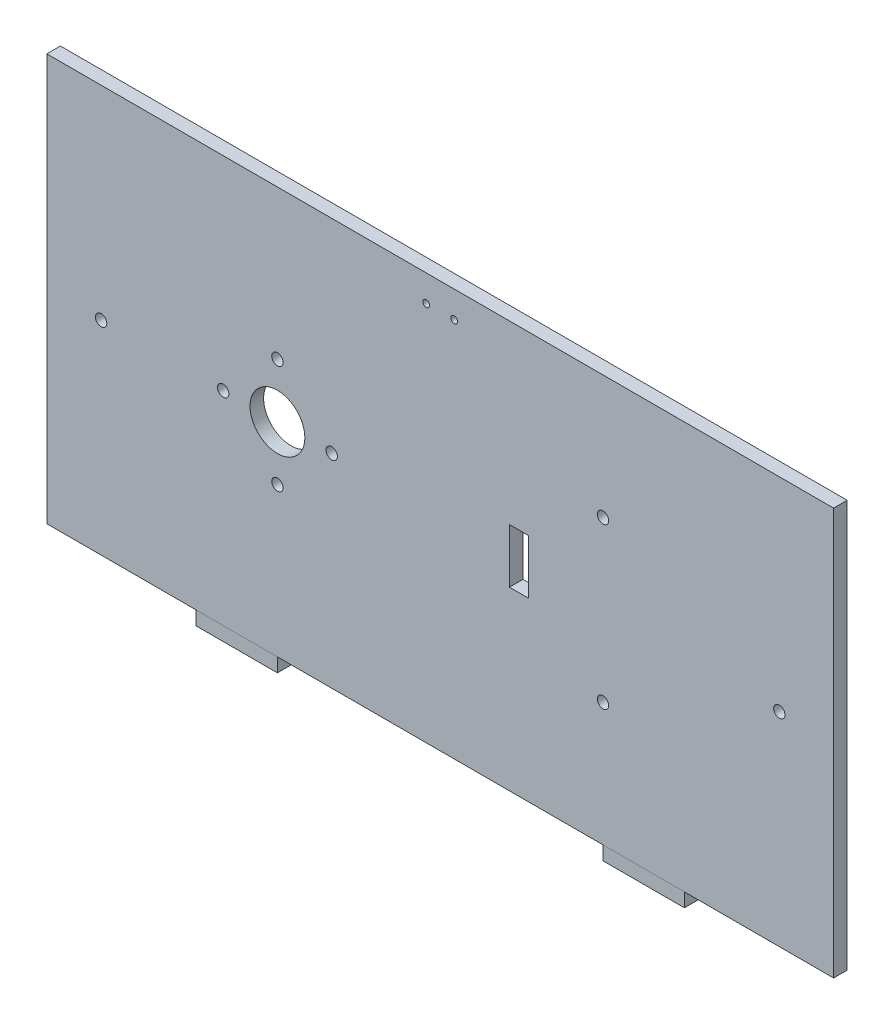
ISO-10303-21;
HEADER;
FILE_DESCRIPTION(('STEP AP214'),'2;1');
FILE_NAME('part.step','',(''),(''),'','','');
FILE_SCHEMA(('AUTOMOTIVE_DESIGN { 1 0 10303 214 1 1 1 1 }'));
ENDSEC;
DATA;
#1=APPLICATION_CONTEXT('core data for automotive mechanical design processes');
#2=APPLICATION_PROTOCOL_DEFINITION('international standard','automotive_design',2000,#1);
#3=PRODUCT_CONTEXT('',#1,'mechanical');
#4=PRODUCT('Part','Part','',(#3));
#5=PRODUCT_RELATED_PRODUCT_CATEGORY('part','',(#4));
#6=PRODUCT_DEFINITION_FORMATION('','',#4);
#7=PRODUCT_DEFINITION_CONTEXT('part definition',#1,'design');
#8=PRODUCT_DEFINITION('design','',#6,#7);
#9=PRODUCT_DEFINITION_SHAPE('','',#8);
#10=(LENGTH_UNIT() NAMED_UNIT(*) SI_UNIT(.MILLI.,.METRE.));
#11=(NAMED_UNIT(*) PLANE_ANGLE_UNIT() SI_UNIT($,.RADIAN.));
#12=(NAMED_UNIT(*) SI_UNIT($,.STERADIAN.) SOLID_ANGLE_UNIT());
#13=UNCERTAINTY_MEASURE_WITH_UNIT(LENGTH_MEASURE(1.E-05),#10,'distance_accuracy_value','');
#14=(GEOMETRIC_REPRESENTATION_CONTEXT(3) GLOBAL_UNCERTAINTY_ASSIGNED_CONTEXT((#13)) GLOBAL_UNIT_ASSIGNED_CONTEXT((#10,
#11,#12)) REPRESENTATION_CONTEXT('',''));
#15=CARTESIAN_POINT('',(0.,0.,0.));
#16=DIRECTION('',(0.,0.,1.));
#17=DIRECTION('',(1.,0.,0.));
#18=AXIS2_PLACEMENT_3D('',#15,#16,#17);
#19=CARTESIAN_POINT('',(0.,-80.1,0.));
#20=DIRECTION('',(0.,-1.,0.));
#21=DIRECTION('',(0.,0.,-1.));
#22=AXIS2_PLACEMENT_3D('',#19,#20,#21);
#23=PLANE('',#22);
#24=DIRECTION('',(1.,0.,0.));
#25=VECTOR('',#24,1.);
#26=CARTESIAN_POINT('',(0.,-80.1,5.));
#27=LINE('',#26,#25);
#28=CARTESIAN_POINT('',(60.,-80.1,5.));
#29=VERTEX_POINT('',#28);
#30=CARTESIAN_POINT('',(90.,-80.1,5.));
#31=VERTEX_POINT('',#30);
#32=EDGE_CURVE('E163',#29,#31,#27,.T.);
#33=ORIENTED_EDGE('',*,*,#32,.F.);
#34=DIRECTION('',(0.,0.,1.));
#35=VECTOR('',#34,1.);
#36=CARTESIAN_POINT('',(60.,-80.1,0.));
#37=LINE('',#36,#35);
#38=CARTESIAN_POINT('',(60.,-80.1,0.));
#39=VERTEX_POINT('',#38);
#40=EDGE_CURVE('E151',#39,#29,#37,.T.);
#41=ORIENTED_EDGE('',*,*,#40,.F.);
#42=DIRECTION('',(1.,0.,0.));
#43=VECTOR('',#42,1.);
#44=CARTESIAN_POINT('',(0.,-80.1,0.));
#45=LINE('',#44,#43);
#46=CARTESIAN_POINT('',(90.,-80.1,0.));
#47=VERTEX_POINT('',#46);
#48=EDGE_CURVE('E174',#39,#47,#45,.T.);
#49=ORIENTED_EDGE('',*,*,#48,.T.);
#50=DIRECTION('',(0.,0.,1.));
#51=VECTOR('',#50,1.);
#52=CARTESIAN_POINT('',(90.,-80.1,0.));
#53=LINE('',#52,#51);
#54=EDGE_CURVE('E149',#47,#31,#53,.T.);
#55=ORIENTED_EDGE('',*,*,#54,.T.);
#56=EDGE_LOOP('',(#33,#41,#49,#55));
#57=FACE_BOUND('',#56,.T.);
#58=ADVANCED_FACE('F101',(#57),#23,.T.);
#59=CARTESIAN_POINT('',(0.,0.,5.));
#60=DIRECTION('',(0.,0.,1.));
#61=DIRECTION('',(1.,0.,0.));
#62=AXIS2_PLACEMENT_3D('',#59,#60,#61);
#63=PLANE('',#62);
#64=DIRECTION('',(0.,-1.,0.));
#65=VECTOR('',#64,1.);
#66=CARTESIAN_POINT('',(90.,0.,5.));
#67=LINE('',#66,#65);
#68=CARTESIAN_POINT('',(90.,-75.,5.));
#69=VERTEX_POINT('',#68);
#70=EDGE_CURVE('E13',#69,#31,#67,.T.);
#71=ORIENTED_EDGE('',*,*,#70,.F.);
#72=DIRECTION('',(1.,0.,0.));
#73=VECTOR('',#72,1.);
#74=CARTESIAN_POINT('',(0.,-75.,5.));
#75=LINE('',#74,#73);
#76=CARTESIAN_POINT('',(60.,-75.,5.));
#77=VERTEX_POINT('',#76);
#78=EDGE_CURVE('E112',#77,#69,#75,.T.);
#79=ORIENTED_EDGE('',*,*,#78,.F.);
#80=DIRECTION('',(0.,-1.,0.));
#81=VECTOR('',#80,1.);
#82=CARTESIAN_POINT('',(60.,0.,5.));
#83=LINE('',#82,#81);
#84=EDGE_CURVE('E154',#77,#29,#83,.T.);
#85=ORIENTED_EDGE('',*,*,#84,.T.);
#86=ORIENTED_EDGE('',*,*,#32,.T.);
#87=EDGE_LOOP('',(#71,#79,#85,#86));
#88=FACE_BOUND('',#87,.T.);
#89=ADVANCED_FACE('F162',(#88),#63,.T.);
#90=CARTESIAN_POINT('',(60.,0.,0.));
#91=DIRECTION('',(-1.,0.,0.));
#92=DIRECTION('',(0.,0.,1.));
#93=AXIS2_PLACEMENT_3D('',#90,#91,#92);
#94=PLANE('',#93);
#95=ORIENTED_EDGE('',*,*,#84,.F.);
#96=DIRECTION('',(0.,0.,1.));
#97=VECTOR('',#96,1.);
#98=CARTESIAN_POINT('',(60.,-75.,0.));
#99=LINE('',#98,#97);
#100=CARTESIAN_POINT('',(60.,-75.,0.));
#101=VERTEX_POINT('',#100);
#102=EDGE_CURVE('E136',#101,#77,#99,.T.);
#103=ORIENTED_EDGE('',*,*,#102,.F.);
#104=DIRECTION('',(0.,-1.,0.));
#105=VECTOR('',#104,1.);
#106=CARTESIAN_POINT('',(60.,0.,0.));
#107=LINE('',#106,#105);
#108=EDGE_CURVE('E155',#101,#39,#107,.T.);
#109=ORIENTED_EDGE('',*,*,#108,.T.);
#110=ORIENTED_EDGE('',*,*,#40,.T.);
#111=EDGE_LOOP('',(#95,#103,#109,#110));
#112=FACE_BOUND('',#111,.T.);
#113=ADVANCED_FACE('F153',(#112),#94,.T.);
#114=CARTESIAN_POINT('',(0.,-75.,0.));
#115=DIRECTION('',(0.,-1.,0.));
#116=DIRECTION('',(0.,0.,-1.));
#117=AXIS2_PLACEMENT_3D('',#114,#115,#116);
#118=PLANE('',#117);
#119=ORIENTED_EDGE('',*,*,#78,.T.);
#120=DIRECTION('',(0.,0.,1.));
#121=VECTOR('',#120,1.);
#122=CARTESIAN_POINT('',(90.,-75.,0.));
#123=LINE('',#122,#121);
#124=CARTESIAN_POINT('',(90.,-75.,0.));
#125=VERTEX_POINT('',#124);
#126=EDGE_CURVE('E177',#125,#69,#123,.T.);
#127=ORIENTED_EDGE('',*,*,#126,.F.);
#128=DIRECTION('',(1.,0.,0.));
#129=VECTOR('',#128,1.);
#130=CARTESIAN_POINT('',(0.,-75.,0.));
#131=LINE('',#130,#129);
#132=EDGE_CURVE('E142',#101,#125,#131,.T.);
#133=ORIENTED_EDGE('',*,*,#132,.F.);
#134=ORIENTED_EDGE('',*,*,#102,.T.);
#135=EDGE_LOOP('',(#119,#127,#133,#134));
#136=FACE_BOUND('',#135,.T.);
#137=ADVANCED_FACE('F187',(#136),#118,.F.);
#138=CARTESIAN_POINT('',(90.,0.,0.));
#139=DIRECTION('',(-1.,0.,0.));
#140=DIRECTION('',(0.,0.,1.));
#141=AXIS2_PLACEMENT_3D('',#138,#139,#140);
#142=PLANE('',#141);
#143=ORIENTED_EDGE('',*,*,#70,.T.);
#144=ORIENTED_EDGE('',*,*,#54,.F.);
#145=DIRECTION('',(0.,-1.,0.));
#146=VECTOR('',#145,1.);
#147=CARTESIAN_POINT('',(90.,0.,0.));
#148=LINE('',#147,#146);
#149=EDGE_CURVE('E105',#125,#47,#148,.T.);
#150=ORIENTED_EDGE('',*,*,#149,.F.);
#151=ORIENTED_EDGE('',*,*,#126,.T.);
#152=EDGE_LOOP('',(#143,#144,#150,#151));
#153=FACE_BOUND('',#152,.T.);
#154=ADVANCED_FACE('F186',(#153),#142,.F.);
#155=CARTESIAN_POINT('',(0.,0.,0.));
#156=DIRECTION('',(0.,0.,1.));
#157=DIRECTION('',(1.,0.,0.));
#158=AXIS2_PLACEMENT_3D('',#155,#156,#157);
#159=PLANE('',#158);
#160=ORIENTED_EDGE('',*,*,#149,.T.);
#161=ORIENTED_EDGE('',*,*,#48,.F.);
#162=ORIENTED_EDGE('',*,*,#108,.F.);
#163=ORIENTED_EDGE('',*,*,#132,.T.);
#164=EDGE_LOOP('',(#160,#161,#162,#163));
#165=FACE_BOUND('',#164,.T.);
#166=ADVANCED_FACE('F103',(#165),#159,.F.);
#167=CLOSED_SHELL('',(#58,#89,#113,#137,#154,#166));
#168=MANIFOLD_SOLID_BREP('B2',#167);
#169=CARTESIAN_POINT('',(0.,-80.1,0.));
#170=DIRECTION('',(0.,-1.,0.));
#171=DIRECTION('',(0.,0.,-1.));
#172=AXIS2_PLACEMENT_3D('',#169,#170,#171);
#173=PLANE('',#172);
#174=DIRECTION('',(1.,0.,0.));
#175=VECTOR('',#174,1.);
#176=CARTESIAN_POINT('',(0.,-80.1,5.));
#177=LINE('',#176,#175);
#178=CARTESIAN_POINT('',(-90.,-80.1,5.));
#179=VERTEX_POINT('',#178);
#180=CARTESIAN_POINT('',(-60.,-80.1,5.));
#181=VERTEX_POINT('',#180);
#182=EDGE_CURVE('E352',#179,#181,#177,.T.);
#183=ORIENTED_EDGE('',*,*,#182,.F.);
#184=DIRECTION('',(0.,0.,1.));
#185=VECTOR('',#184,1.);
#186=CARTESIAN_POINT('',(-90.,-80.1,0.));
#187=LINE('',#186,#185);
#188=CARTESIAN_POINT('',(-90.,-80.1,0.));
#189=VERTEX_POINT('',#188);
#190=EDGE_CURVE('E286',#189,#179,#187,.T.);
#191=ORIENTED_EDGE('',*,*,#190,.F.);
#192=DIRECTION('',(1.,0.,0.));
#193=VECTOR('',#192,1.);
#194=CARTESIAN_POINT('',(0.,-80.1,0.));
#195=LINE('',#194,#193);
#196=CARTESIAN_POINT('',(-60.,-80.1,0.));
#197=VERTEX_POINT('',#196);
#198=EDGE_CURVE('E336',#189,#197,#195,.T.);
#199=ORIENTED_EDGE('',*,*,#198,.T.);
#200=DIRECTION('',(0.,0.,1.));
#201=VECTOR('',#200,1.);
#202=CARTESIAN_POINT('',(-60.,-80.1,0.));
#203=LINE('',#202,#201);
#204=EDGE_CURVE('E99',#197,#181,#203,.T.);
#205=ORIENTED_EDGE('',*,*,#204,.T.);
#206=EDGE_LOOP('',(#183,#191,#199,#205));
#207=FACE_BOUND('',#206,.T.);
#208=ADVANCED_FACE('F275',(#207),#173,.T.);
#209=CARTESIAN_POINT('',(0.,0.,5.));
#210=DIRECTION('',(0.,0.,1.));
#211=DIRECTION('',(1.,0.,0.));
#212=AXIS2_PLACEMENT_3D('',#209,#210,#211);
#213=PLANE('',#212);
#214=DIRECTION('',(0.,-1.,0.));
#215=VECTOR('',#214,1.);
#216=CARTESIAN_POINT('',(-60.,0.,5.));
#217=LINE('',#216,#215);
#218=CARTESIAN_POINT('',(-60.,-75.,5.));
#219=VERTEX_POINT('',#218);
#220=EDGE_CURVE('E344',#219,#181,#217,.T.);
#221=ORIENTED_EDGE('',*,*,#220,.F.);
#222=DIRECTION('',(1.,0.,0.));
#223=VECTOR('',#222,1.);
#224=CARTESIAN_POINT('',(0.,-75.,5.));
#225=LINE('',#224,#223);
#226=CARTESIAN_POINT('',(-90.,-75.,5.));
#227=VERTEX_POINT('',#226);
#228=EDGE_CURVE('E347',#227,#219,#225,.T.);
#229=ORIENTED_EDGE('',*,*,#228,.F.);
#230=DIRECTION('',(0.,-1.,0.));
#231=VECTOR('',#230,1.);
#232=CARTESIAN_POINT('',(-90.,0.,5.));
#233=LINE('',#232,#231);
#234=EDGE_CURVE('E327',#227,#179,#233,.T.);
#235=ORIENTED_EDGE('',*,*,#234,.T.);
#236=ORIENTED_EDGE('',*,*,#182,.T.);
#237=EDGE_LOOP('',(#221,#229,#235,#236));
#238=FACE_BOUND('',#237,.T.);
#239=ADVANCED_FACE('F361',(#238),#213,.T.);
#240=CARTESIAN_POINT('',(-90.,0.,0.));
#241=DIRECTION('',(-1.,0.,0.));
#242=DIRECTION('',(0.,0.,1.));
#243=AXIS2_PLACEMENT_3D('',#240,#241,#242);
#244=PLANE('',#243);
#245=ORIENTED_EDGE('',*,*,#234,.F.);
#246=DIRECTION('',(0.,0.,1.));
#247=VECTOR('',#246,1.);
#248=CARTESIAN_POINT('',(-90.,-75.,0.));
#249=LINE('',#248,#247);
#250=CARTESIAN_POINT('',(-90.,-75.,0.));
#251=VERTEX_POINT('',#250);
#252=EDGE_CURVE('E324',#251,#227,#249,.T.);
#253=ORIENTED_EDGE('',*,*,#252,.F.);
#254=DIRECTION('',(0.,-1.,0.));
#255=VECTOR('',#254,1.);
#256=CARTESIAN_POINT('',(-90.,0.,0.));
#257=LINE('',#256,#255);
#258=EDGE_CURVE('E326',#251,#189,#257,.T.);
#259=ORIENTED_EDGE('',*,*,#258,.T.);
#260=ORIENTED_EDGE('',*,*,#190,.T.);
#261=EDGE_LOOP('',(#245,#253,#259,#260));
#262=FACE_BOUND('',#261,.T.);
#263=ADVANCED_FACE('F325',(#262),#244,.T.);
#264=CARTESIAN_POINT('',(0.,-75.,0.));
#265=DIRECTION('',(0.,-1.,0.));
#266=DIRECTION('',(0.,0.,-1.));
#267=AXIS2_PLACEMENT_3D('',#264,#265,#266);
#268=PLANE('',#267);
#269=ORIENTED_EDGE('',*,*,#228,.T.);
#270=DIRECTION('',(0.,0.,1.));
#271=VECTOR('',#270,1.);
#272=CARTESIAN_POINT('',(-60.,-75.,0.));
#273=LINE('',#272,#271);
#274=CARTESIAN_POINT('',(-60.,-75.,0.));
#275=VERTEX_POINT('',#274);
#276=EDGE_CURVE('E279',#275,#219,#273,.T.);
#277=ORIENTED_EDGE('',*,*,#276,.F.);
#278=DIRECTION('',(1.,0.,0.));
#279=VECTOR('',#278,1.);
#280=CARTESIAN_POINT('',(0.,-75.,0.));
#281=LINE('',#280,#279);
#282=EDGE_CURVE('E321',#251,#275,#281,.T.);
#283=ORIENTED_EDGE('',*,*,#282,.F.);
#284=ORIENTED_EDGE('',*,*,#252,.T.);
#285=EDGE_LOOP('',(#269,#277,#283,#284));
#286=FACE_BOUND('',#285,.T.);
#287=ADVANCED_FACE('F331',(#286),#268,.F.);
#288=CARTESIAN_POINT('',(-60.,0.,0.));
#289=DIRECTION('',(-1.,0.,0.));
#290=DIRECTION('',(0.,0.,1.));
#291=AXIS2_PLACEMENT_3D('',#288,#289,#290);
#292=PLANE('',#291);
#293=ORIENTED_EDGE('',*,*,#220,.T.);
#294=ORIENTED_EDGE('',*,*,#204,.F.);
#295=DIRECTION('',(0.,-1.,0.));
#296=VECTOR('',#295,1.);
#297=CARTESIAN_POINT('',(-60.,0.,0.));
#298=LINE('',#297,#296);
#299=EDGE_CURVE('E295',#275,#197,#298,.T.);
#300=ORIENTED_EDGE('',*,*,#299,.F.);
#301=ORIENTED_EDGE('',*,*,#276,.T.);
#302=EDGE_LOOP('',(#293,#294,#300,#301));
#303=FACE_BOUND('',#302,.T.);
#304=ADVANCED_FACE('F277',(#303),#292,.F.);
#305=CARTESIAN_POINT('',(0.,0.,0.));
#306=DIRECTION('',(0.,0.,1.));
#307=DIRECTION('',(1.,0.,0.));
#308=AXIS2_PLACEMENT_3D('',#305,#306,#307);
#309=PLANE('',#308);
#310=ORIENTED_EDGE('',*,*,#299,.T.);
#311=ORIENTED_EDGE('',*,*,#198,.F.);
#312=ORIENTED_EDGE('',*,*,#258,.F.);
#313=ORIENTED_EDGE('',*,*,#282,.T.);
#314=EDGE_LOOP('',(#310,#311,#312,#313));
#315=FACE_BOUND('',#314,.T.);
#316=ADVANCED_FACE('F335',(#315),#309,.F.);
#317=CLOSED_SHELL('',(#208,#239,#263,#287,#304,#316));
#318=MANIFOLD_SOLID_BREP('B7',#317);
#319=CARTESIAN_POINT('',(145.,75.,5.));
#320=DIRECTION('',(-1.,0.,0.));
#321=DIRECTION('',(0.,-1.,0.));
#322=AXIS2_PLACEMENT_3D('',#319,#320,#321);
#323=PLANE('',#322);
#324=DIRECTION('',(0.,1.,0.));
#325=VECTOR('',#324,1.);
#326=CARTESIAN_POINT('',(145.,75.,0.));
#327=LINE('',#326,#325);
#328=CARTESIAN_POINT('',(145.,-75.,0.));
#329=VERTEX_POINT('',#328);
#330=CARTESIAN_POINT('',(145.,75.,0.));
#331=VERTEX_POINT('',#330);
#332=EDGE_CURVE('E634',#329,#331,#327,.T.);
#333=ORIENTED_EDGE('',*,*,#332,.T.);
#334=DIRECTION('',(0.,0.,-1.));
#335=VECTOR('',#334,1.);
#336=CARTESIAN_POINT('',(145.,75.,5.));
#337=LINE('',#336,#335);
#338=CARTESIAN_POINT('',(145.,75.,5.));
#339=VERTEX_POINT('',#338);
#340=EDGE_CURVE('E273',#339,#331,#337,.T.);
#341=ORIENTED_EDGE('',*,*,#340,.F.);
#342=DIRECTION('',(0.,1.,0.));
#343=VECTOR('',#342,1.);
#344=CARTESIAN_POINT('',(145.,75.,5.));
#345=LINE('',#344,#343);
#346=CARTESIAN_POINT('',(145.,-75.,5.));
#347=VERTEX_POINT('',#346);
#348=EDGE_CURVE('E646',#347,#339,#345,.T.);
#349=ORIENTED_EDGE('',*,*,#348,.F.);
#350=DIRECTION('',(0.,0.,-1.));
#351=VECTOR('',#350,1.);
#352=CARTESIAN_POINT('',(145.,-75.,5.));
#353=LINE('',#352,#351);
#354=EDGE_CURVE('E660',#347,#329,#353,.T.);
#355=ORIENTED_EDGE('',*,*,#354,.T.);
#356=EDGE_LOOP('',(#333,#341,#349,#355));
#357=FACE_BOUND('',#356,.T.);
#358=ADVANCED_FACE('F446',(#357),#323,.F.);
#359=CARTESIAN_POINT('',(-145.,75.,5.));
#360=DIRECTION('',(0.,-1.,0.));
#361=DIRECTION('',(0.,0.,-1.));
#362=AXIS2_PLACEMENT_3D('',#359,#360,#361);
#363=PLANE('',#362);
#364=DIRECTION('',(-1.,0.,0.));
#365=VECTOR('',#364,1.);
#366=CARTESIAN_POINT('',(-145.,75.,0.));
#367=LINE('',#366,#365);
#368=CARTESIAN_POINT('',(-145.,75.,0.));
#369=VERTEX_POINT('',#368);
#370=EDGE_CURVE('E664',#331,#369,#367,.T.);
#371=ORIENTED_EDGE('',*,*,#370,.T.);
#372=DIRECTION('',(0.,0.,-1.));
#373=VECTOR('',#372,1.);
#374=CARTESIAN_POINT('',(-145.,75.,5.));
#375=LINE('',#374,#373);
#376=CARTESIAN_POINT('',(-145.,75.,5.));
#377=VERTEX_POINT('',#376);
#378=EDGE_CURVE('E454',#377,#369,#375,.T.);
#379=ORIENTED_EDGE('',*,*,#378,.F.);
#380=DIRECTION('',(-1.,0.,0.));
#381=VECTOR('',#380,1.);
#382=CARTESIAN_POINT('',(-145.,75.,5.));
#383=LINE('',#382,#381);
#384=EDGE_CURVE('E650',#339,#377,#383,.T.);
#385=ORIENTED_EDGE('',*,*,#384,.F.);
#386=ORIENTED_EDGE('',*,*,#340,.T.);
#387=EDGE_LOOP('',(#371,#379,#385,#386));
#388=FACE_BOUND('',#387,.T.);
#389=ADVANCED_FACE('F699',(#388),#363,.F.);
#390=CARTESIAN_POINT('',(-145.,75.,5.));
#391=DIRECTION('',(1.,0.,0.));
#392=DIRECTION('',(0.,1.,0.));
#393=AXIS2_PLACEMENT_3D('',#390,#391,#392);
#394=PLANE('',#393);
#395=DIRECTION('',(0.,-1.,0.));
#396=VECTOR('',#395,1.);
#397=CARTESIAN_POINT('',(-145.,75.,0.));
#398=LINE('',#397,#396);
#399=CARTESIAN_POINT('',(-145.,-75.,0.));
#400=VERTEX_POINT('',#399);
#401=EDGE_CURVE('E667',#369,#400,#398,.T.);
#402=ORIENTED_EDGE('',*,*,#401,.T.);
#403=DIRECTION('',(0.,0.,-1.));
#404=VECTOR('',#403,1.);
#405=CARTESIAN_POINT('',(-145.,-75.,5.));
#406=LINE('',#405,#404);
#407=CARTESIAN_POINT('',(-145.,-75.,5.));
#408=VERTEX_POINT('',#407);
#409=EDGE_CURVE('E675',#408,#400,#406,.T.);
#410=ORIENTED_EDGE('',*,*,#409,.F.);
#411=DIRECTION('',(0.,-1.,0.));
#412=VECTOR('',#411,1.);
#413=CARTESIAN_POINT('',(-145.,75.,5.));
#414=LINE('',#413,#412);
#415=EDGE_CURVE('E654',#377,#408,#414,.T.);
#416=ORIENTED_EDGE('',*,*,#415,.F.);
#417=ORIENTED_EDGE('',*,*,#378,.T.);
#418=EDGE_LOOP('',(#402,#410,#416,#417));
#419=FACE_BOUND('',#418,.T.);
#420=ADVANCED_FACE('F684',(#419),#394,.F.);
#421=CARTESIAN_POINT('',(-145.,-75.,5.));
#422=DIRECTION('',(0.,1.,0.));
#423=DIRECTION('',(0.,0.,1.));
#424=AXIS2_PLACEMENT_3D('',#421,#422,#423);
#425=PLANE('',#424);
#426=DIRECTION('',(1.,0.,0.));
#427=VECTOR('',#426,1.);
#428=CARTESIAN_POINT('',(-145.,-75.,0.));
#429=LINE('',#428,#427);
#430=EDGE_CURVE('E651',#400,#329,#429,.T.);
#431=ORIENTED_EDGE('',*,*,#430,.T.);
#432=ORIENTED_EDGE('',*,*,#354,.F.);
#433=DIRECTION('',(1.,0.,0.));
#434=VECTOR('',#433,1.);
#435=CARTESIAN_POINT('',(-145.,-75.,5.));
#436=LINE('',#435,#434);
#437=EDGE_CURVE('E657',#408,#347,#436,.T.);
#438=ORIENTED_EDGE('',*,*,#437,.F.);
#439=ORIENTED_EDGE('',*,*,#409,.T.);
#440=EDGE_LOOP('',(#431,#432,#438,#439));
#441=FACE_BOUND('',#440,.T.);
#442=ADVANCED_FACE('F692',(#441),#425,.F.);
#443=CARTESIAN_POINT('',(0.,0.,5.));
#444=DIRECTION('',(0.,0.,1.));
#445=DIRECTION('',(1.,0.,0.));
#446=AXIS2_PLACEMENT_3D('',#443,#444,#445);
#447=PLANE('',#446);
#448=DIRECTION('',(0.,-1.,0.));
#449=VECTOR('',#448,1.);
#450=CARTESIAN_POINT('',(25.5,0.,5.));
#451=LINE('',#450,#449);
#452=CARTESIAN_POINT('',(25.5,9.99999999999999,5.));
#453=VERTEX_POINT('',#452);
#454=CARTESIAN_POINT('',(25.5,-10.,5.));
#455=VERTEX_POINT('',#454);
#456=EDGE_CURVE('E556',#453,#455,#451,.T.);
#457=ORIENTED_EDGE('',*,*,#456,.F.);
#458=DIRECTION('',(-1.,0.,0.));
#459=VECTOR('',#458,1.);
#460=CARTESIAN_POINT('',(0.,9.99999999999999,5.));
#461=LINE('',#460,#459);
#462=CARTESIAN_POINT('',(32.5,9.99999999999999,5.));
#463=VERTEX_POINT('',#462);
#464=EDGE_CURVE('E544',#463,#453,#461,.T.);
#465=ORIENTED_EDGE('',*,*,#464,.F.);
#466=DIRECTION('',(0.,1.,0.));
#467=VECTOR('',#466,1.);
#468=CARTESIAN_POINT('',(32.5,0.,5.));
#469=LINE('',#468,#467);
#470=CARTESIAN_POINT('',(32.5,-10.,5.));
#471=VERTEX_POINT('',#470);
#472=EDGE_CURVE('E517',#471,#463,#469,.T.);
#473=ORIENTED_EDGE('',*,*,#472,.F.);
#474=DIRECTION('',(1.,0.,0.));
#475=VECTOR('',#474,1.);
#476=CARTESIAN_POINT('',(0.,-10.,5.));
#477=LINE('',#476,#475);
#478=EDGE_CURVE('E553',#455,#471,#477,.T.);
#479=ORIENTED_EDGE('',*,*,#478,.F.);
#480=EDGE_LOOP('',(#457,#465,#473,#479));
#481=FACE_BOUND('',#480,.T.);
#482=CARTESIAN_POINT('',(-60.,20.,5.));
#483=DIRECTION('',(0.,0.,1.));
#484=DIRECTION('',(1.,0.,0.));
#485=AXIS2_PLACEMENT_3D('',#482,#483,#484);
#486=CIRCLE('',#485,2.1);
#487=CARTESIAN_POINT('',(-57.9,20.,5.));
#488=VERTEX_POINT('',#487);
#489=EDGE_CURVE('E585',#488,#488,#486,.T.);
#490=ORIENTED_EDGE('',*,*,#489,.F.);
#491=EDGE_LOOP('',(#490));
#492=FACE_BOUND('',#491,.T.);
#493=CARTESIAN_POINT('',(-80.,0.,5.));
#494=DIRECTION('',(0.,0.,1.));
#495=DIRECTION('',(1.,0.,0.));
#496=AXIS2_PLACEMENT_3D('',#493,#494,#495);
#497=CIRCLE('',#496,2.1);
#498=CARTESIAN_POINT('',(-77.9,0.,5.));
#499=VERTEX_POINT('',#498);
#500=EDGE_CURVE('E582',#499,#499,#497,.T.);
#501=ORIENTED_EDGE('',*,*,#500,.F.);
#502=EDGE_LOOP('',(#501));
#503=FACE_BOUND('',#502,.T.);
#504=CARTESIAN_POINT('',(-60.,-20.,5.));
#505=DIRECTION('',(0.,0.,1.));
#506=DIRECTION('',(1.,0.,0.));
#507=AXIS2_PLACEMENT_3D('',#504,#505,#506);
#508=CIRCLE('',#507,2.1);
#509=CARTESIAN_POINT('',(-57.9,-20.,5.));
#510=VERTEX_POINT('',#509);
#511=EDGE_CURVE('E579',#510,#510,#508,.T.);
#512=ORIENTED_EDGE('',*,*,#511,.F.);
#513=EDGE_LOOP('',(#512));
#514=FACE_BOUND('',#513,.T.);
#515=CARTESIAN_POINT('',(-40.,0.,5.));
#516=DIRECTION('',(0.,0.,1.));
#517=DIRECTION('',(1.,0.,0.));
#518=AXIS2_PLACEMENT_3D('',#515,#516,#517);
#519=CIRCLE('',#518,2.1);
#520=CARTESIAN_POINT('',(-37.9,0.,5.));
#521=VERTEX_POINT('',#520);
#522=EDGE_CURVE('E564',#521,#521,#519,.T.);
#523=ORIENTED_EDGE('',*,*,#522,.F.);
#524=EDGE_LOOP('',(#523));
#525=FACE_BOUND('',#524,.T.);
#526=CARTESIAN_POINT('',(60.,29.5,5.));
#527=DIRECTION('',(0.,0.,1.));
#528=DIRECTION('',(1.,0.,0.));
#529=AXIS2_PLACEMENT_3D('',#526,#527,#528);
#530=CIRCLE('',#529,2.1);
#531=CARTESIAN_POINT('',(62.1,29.5,5.));
#532=VERTEX_POINT('',#531);
#533=EDGE_CURVE('E601',#532,#532,#530,.T.);
#534=ORIENTED_EDGE('',*,*,#533,.F.);
#535=EDGE_LOOP('',(#534));
#536=FACE_BOUND('',#535,.T.);
#537=CARTESIAN_POINT('',(60.,-29.5,5.));
#538=DIRECTION('',(0.,0.,1.));
#539=DIRECTION('',(1.,0.,0.));
#540=AXIS2_PLACEMENT_3D('',#537,#538,#539);
#541=CIRCLE('',#540,2.1);
#542=CARTESIAN_POINT('',(62.1,-29.5,5.));
#543=VERTEX_POINT('',#542);
#544=EDGE_CURVE('E594',#543,#543,#541,.T.);
#545=ORIENTED_EDGE('',*,*,#544,.F.);
#546=EDGE_LOOP('',(#545));
#547=FACE_BOUND('',#546,.T.);
#548=CARTESIAN_POINT('',(-60.,0.,5.));
#549=DIRECTION('',(0.,0.,1.));
#550=DIRECTION('',(1.,0.,0.));
#551=AXIS2_PLACEMENT_3D('',#548,#549,#550);
#552=CIRCLE('',#551,10.1);
#553=CARTESIAN_POINT('',(-49.9,0.,5.));
#554=VERTEX_POINT('',#553);
#555=EDGE_CURVE('E609',#554,#554,#552,.T.);
#556=ORIENTED_EDGE('',*,*,#555,.F.);
#557=EDGE_LOOP('',(#556));
#558=FACE_BOUND('',#557,.T.);
#559=CARTESIAN_POINT('',(125.,0.,5.));
#560=DIRECTION('',(0.,0.,1.));
#561=DIRECTION('',(1.,0.,0.));
#562=AXIS2_PLACEMENT_3D('',#559,#560,#561);
#563=CIRCLE('',#562,2.1);
#564=CARTESIAN_POINT('',(127.1,0.,5.));
#565=VERTEX_POINT('',#564);
#566=EDGE_CURVE('E625',#565,#565,#563,.T.);
#567=ORIENTED_EDGE('',*,*,#566,.F.);
#568=EDGE_LOOP('',(#567));
#569=FACE_BOUND('',#568,.T.);
#570=CARTESIAN_POINT('',(-125.,0.,5.));
#571=DIRECTION('',(0.,0.,1.));
#572=DIRECTION('',(1.,0.,0.));
#573=AXIS2_PLACEMENT_3D('',#570,#571,#572);
#574=CIRCLE('',#573,2.1);
#575=CARTESIAN_POINT('',(-122.9,0.,5.));
#576=VERTEX_POINT('',#575);
#577=EDGE_CURVE('E618',#576,#576,#574,.T.);
#578=ORIENTED_EDGE('',*,*,#577,.F.);
#579=EDGE_LOOP('',(#578));
#580=FACE_BOUND('',#579,.T.);
#581=CARTESIAN_POINT('',(-5.15000000000003,65.2,5.));
#582=DIRECTION('',(0.,0.,1.));
#583=DIRECTION('',(1.,0.,0.));
#584=AXIS2_PLACEMENT_3D('',#581,#582,#583);
#585=CIRCLE('',#584,1.25);
#586=CARTESIAN_POINT('',(-3.90000000000003,65.2,5.));
#587=VERTEX_POINT('',#586);
#588=EDGE_CURVE('E635',#587,#587,#585,.T.);
#589=ORIENTED_EDGE('',*,*,#588,.F.);
#590=EDGE_LOOP('',(#589));
#591=FACE_BOUND('',#590,.T.);
#592=CARTESIAN_POINT('',(5.14999999999997,65.2,5.));
#593=DIRECTION('',(0.,0.,1.));
#594=DIRECTION('',(1.,0.,0.));
#595=AXIS2_PLACEMENT_3D('',#592,#593,#594);
#596=CIRCLE('',#595,1.25);
#597=CARTESIAN_POINT('',(6.39999999999997,65.2,5.));
#598=VERTEX_POINT('',#597);
#599=EDGE_CURVE('E629',#598,#598,#596,.T.);
#600=ORIENTED_EDGE('',*,*,#599,.F.);
#601=EDGE_LOOP('',(#600));
#602=FACE_BOUND('',#601,.T.);
#603=ORIENTED_EDGE('',*,*,#348,.T.);
#604=ORIENTED_EDGE('',*,*,#384,.T.);
#605=ORIENTED_EDGE('',*,*,#415,.T.);
#606=ORIENTED_EDGE('',*,*,#437,.T.);
#607=EDGE_LOOP('',(#603,#604,#605,#606));
#608=FACE_BOUND('',#607,.T.);
#609=ADVANCED_FACE('F698',(#481,#492,#503,#514,#525,#536,#547,#558,#569,#580,#591,#602,#608),
#447,.T.);
#610=CARTESIAN_POINT('',(0.,0.,0.));
#611=DIRECTION('',(0.,0.,1.));
#612=DIRECTION('',(1.,0.,0.));
#613=AXIS2_PLACEMENT_3D('',#610,#611,#612);
#614=PLANE('',#613);
#615=DIRECTION('',(1.,0.,0.));
#616=VECTOR('',#615,1.);
#617=CARTESIAN_POINT('',(32.5,9.99999999999999,0.));
#618=LINE('',#617,#616);
#619=CARTESIAN_POINT('',(25.5,9.99999999999999,0.));
#620=VERTEX_POINT('',#619);
#621=CARTESIAN_POINT('',(32.5,9.99999999999999,0.));
#622=VERTEX_POINT('',#621);
#623=EDGE_CURVE('E524',#620,#622,#618,.T.);
#624=ORIENTED_EDGE('',*,*,#623,.F.);
#625=DIRECTION('',(0.,1.,0.));
#626=VECTOR('',#625,1.);
#627=CARTESIAN_POINT('',(25.5,9.99999999999999,0.));
#628=LINE('',#627,#626);
#629=CARTESIAN_POINT('',(25.5,-10.,0.));
#630=VERTEX_POINT('',#629);
#631=EDGE_CURVE('E469',#630,#620,#628,.T.);
#632=ORIENTED_EDGE('',*,*,#631,.F.);
#633=DIRECTION('',(-1.,0.,0.));
#634=VECTOR('',#633,1.);
#635=CARTESIAN_POINT('',(32.5,-10.,0.));
#636=LINE('',#635,#634);
#637=CARTESIAN_POINT('',(32.5,-10.,0.));
#638=VERTEX_POINT('',#637);
#639=EDGE_CURVE('E532',#638,#630,#636,.T.);
#640=ORIENTED_EDGE('',*,*,#639,.F.);
#641=DIRECTION('',(0.,-1.,0.));
#642=VECTOR('',#641,1.);
#643=CARTESIAN_POINT('',(32.5,9.99999999999999,0.));
#644=LINE('',#643,#642);
#645=EDGE_CURVE('E514',#622,#638,#644,.T.);
#646=ORIENTED_EDGE('',*,*,#645,.F.);
#647=EDGE_LOOP('',(#624,#632,#640,#646));
#648=FACE_BOUND('',#647,.T.);
#649=CARTESIAN_POINT('',(-60.,20.,0.));
#650=DIRECTION('',(0.,0.,-1.));
#651=DIRECTION('',(-1.,0.,0.));
#652=AXIS2_PLACEMENT_3D('',#649,#650,#651);
#653=CIRCLE('',#652,2.1);
#654=CARTESIAN_POINT('',(-62.1,20.,0.));
#655=VERTEX_POINT('',#654);
#656=EDGE_CURVE('E560',#655,#655,#653,.T.);
#657=ORIENTED_EDGE('',*,*,#656,.F.);
#658=EDGE_LOOP('',(#657));
#659=FACE_BOUND('',#658,.T.);
#660=CARTESIAN_POINT('',(-80.,0.,0.));
#661=DIRECTION('',(0.,0.,-1.));
#662=DIRECTION('',(-1.,0.,0.));
#663=AXIS2_PLACEMENT_3D('',#660,#661,#662);
#664=CIRCLE('',#663,2.1);
#665=CARTESIAN_POINT('',(-82.1,0.,0.));
#666=VERTEX_POINT('',#665);
#667=EDGE_CURVE('E565',#666,#666,#664,.T.);
#668=ORIENTED_EDGE('',*,*,#667,.F.);
#669=EDGE_LOOP('',(#668));
#670=FACE_BOUND('',#669,.T.);
#671=CARTESIAN_POINT('',(-60.,-20.,0.));
#672=DIRECTION('',(0.,0.,-1.));
#673=DIRECTION('',(-1.,0.,0.));
#674=AXIS2_PLACEMENT_3D('',#671,#672,#673);
#675=CIRCLE('',#674,2.1);
#676=CARTESIAN_POINT('',(-62.1,-20.,0.));
#677=VERTEX_POINT('',#676);
#678=EDGE_CURVE('E569',#677,#677,#675,.T.);
#679=ORIENTED_EDGE('',*,*,#678,.F.);
#680=EDGE_LOOP('',(#679));
#681=FACE_BOUND('',#680,.T.);
#682=CARTESIAN_POINT('',(-40.,0.,0.));
#683=DIRECTION('',(0.,0.,-1.));
#684=DIRECTION('',(-1.,0.,0.));
#685=AXIS2_PLACEMENT_3D('',#682,#683,#684);
#686=CIRCLE('',#685,2.1);
#687=CARTESIAN_POINT('',(-42.1,0.,0.));
#688=VERTEX_POINT('',#687);
#689=EDGE_CURVE('E559',#688,#688,#686,.T.);
#690=ORIENTED_EDGE('',*,*,#689,.F.);
#691=EDGE_LOOP('',(#690));
#692=FACE_BOUND('',#691,.T.);
#693=CARTESIAN_POINT('',(60.,29.5,0.));
#694=DIRECTION('',(0.,0.,-1.));
#695=DIRECTION('',(-1.,0.,0.));
#696=AXIS2_PLACEMENT_3D('',#693,#694,#695);
#697=CIRCLE('',#696,2.1);
#698=CARTESIAN_POINT('',(57.9,29.5,0.));
#699=VERTEX_POINT('',#698);
#700=EDGE_CURVE('E590',#699,#699,#697,.T.);
#701=ORIENTED_EDGE('',*,*,#700,.F.);
#702=EDGE_LOOP('',(#701));
#703=FACE_BOUND('',#702,.T.);
#704=CARTESIAN_POINT('',(60.,-29.5,0.));
#705=DIRECTION('',(0.,0.,-1.));
#706=DIRECTION('',(-1.,0.,0.));
#707=AXIS2_PLACEMENT_3D('',#704,#705,#706);
#708=CIRCLE('',#707,2.1);
#709=CARTESIAN_POINT('',(57.9,-29.5,0.));
#710=VERTEX_POINT('',#709);
#711=EDGE_CURVE('E589',#710,#710,#708,.T.);
#712=ORIENTED_EDGE('',*,*,#711,.F.);
#713=EDGE_LOOP('',(#712));
#714=FACE_BOUND('',#713,.T.);
#715=CARTESIAN_POINT('',(-60.,0.,0.));
#716=DIRECTION('',(0.,0.,-1.));
#717=DIRECTION('',(-1.,0.,0.));
#718=AXIS2_PLACEMENT_3D('',#715,#716,#717);
#719=CIRCLE('',#718,10.1);
#720=CARTESIAN_POINT('',(-70.1,0.,0.));
#721=VERTEX_POINT('',#720);
#722=EDGE_CURVE('E605',#721,#721,#719,.T.);
#723=ORIENTED_EDGE('',*,*,#722,.F.);
#724=EDGE_LOOP('',(#723));
#725=FACE_BOUND('',#724,.T.);
#726=CARTESIAN_POINT('',(125.,0.,0.));
#727=DIRECTION('',(0.,0.,-1.));
#728=DIRECTION('',(-1.,0.,0.));
#729=AXIS2_PLACEMENT_3D('',#726,#727,#728);
#730=CIRCLE('',#729,2.1);
#731=CARTESIAN_POINT('',(122.9,0.,0.));
#732=VERTEX_POINT('',#731);
#733=EDGE_CURVE('E614',#732,#732,#730,.T.);
#734=ORIENTED_EDGE('',*,*,#733,.F.);
#735=EDGE_LOOP('',(#734));
#736=FACE_BOUND('',#735,.T.);
#737=CARTESIAN_POINT('',(-125.,0.,0.));
#738=DIRECTION('',(0.,0.,-1.));
#739=DIRECTION('',(1.,0.,0.));
#740=AXIS2_PLACEMENT_3D('',#737,#738,#739);
#741=CIRCLE('',#740,2.1);
#742=CARTESIAN_POINT('',(-122.9,0.,0.));
#743=VERTEX_POINT('',#742);
#744=EDGE_CURVE('E613',#743,#743,#741,.T.);
#745=ORIENTED_EDGE('',*,*,#744,.F.);
#746=EDGE_LOOP('',(#745));
#747=FACE_BOUND('',#746,.T.);
#748=CARTESIAN_POINT('',(-5.15000000000003,65.2,0.));
#749=DIRECTION('',(0.,0.,1.));
#750=DIRECTION('',(1.,0.,0.));
#751=AXIS2_PLACEMENT_3D('',#748,#749,#750);
#752=CIRCLE('',#751,1.25);
#753=CARTESIAN_POINT('',(-3.90000000000003,65.2,0.));
#754=VERTEX_POINT('',#753);
#755=EDGE_CURVE('E630',#754,#754,#752,.T.);
#756=ORIENTED_EDGE('',*,*,#755,.T.);
#757=EDGE_LOOP('',(#756));
#758=FACE_BOUND('',#757,.T.);
#759=CARTESIAN_POINT('',(5.14999999999997,65.2,0.));
#760=DIRECTION('',(0.,0.,1.));
#761=DIRECTION('',(1.,0.,0.));
#762=AXIS2_PLACEMENT_3D('',#759,#760,#761);
#763=CIRCLE('',#762,1.25);
#764=CARTESIAN_POINT('',(6.39999999999997,65.2,0.));
#765=VERTEX_POINT('',#764);
#766=EDGE_CURVE('E639',#765,#765,#763,.T.);
#767=ORIENTED_EDGE('',*,*,#766,.T.);
#768=EDGE_LOOP('',(#767));
#769=FACE_BOUND('',#768,.T.);
#770=ORIENTED_EDGE('',*,*,#332,.F.);
#771=ORIENTED_EDGE('',*,*,#430,.F.);
#772=ORIENTED_EDGE('',*,*,#401,.F.);
#773=ORIENTED_EDGE('',*,*,#370,.F.);
#774=EDGE_LOOP('',(#770,#771,#772,#773));
#775=FACE_BOUND('',#774,.T.);
#776=ADVANCED_FACE('F529',(#648,#659,#670,#681,#692,#703,#714,#725,#736,#747,#758,#769,#775),
#614,.F.);
#777=CARTESIAN_POINT('',(5.14999999999997,65.2,0.));
#778=DIRECTION('',(0.,0.,1.));
#779=DIRECTION('',(1.,0.,0.));
#780=AXIS2_PLACEMENT_3D('',#777,#778,#779);
#781=CYLINDRICAL_SURFACE('',#780,1.25);
#782=ORIENTED_EDGE('',*,*,#766,.F.);
#783=EDGE_LOOP('',(#782));
#784=FACE_BOUND('',#783,.T.);
#785=ORIENTED_EDGE('',*,*,#599,.T.);
#786=EDGE_LOOP('',(#785));
#787=FACE_BOUND('',#786,.T.);
#788=ADVANCED_FACE('F711',(#784,#787),#781,.F.);
#789=CARTESIAN_POINT('',(-5.15000000000003,65.2,0.));
#790=DIRECTION('',(0.,0.,1.));
#791=DIRECTION('',(1.,0.,0.));
#792=AXIS2_PLACEMENT_3D('',#789,#790,#791);
#793=CYLINDRICAL_SURFACE('',#792,1.25);
#794=ORIENTED_EDGE('',*,*,#755,.F.);
#795=EDGE_LOOP('',(#794));
#796=FACE_BOUND('',#795,.T.);
#797=ORIENTED_EDGE('',*,*,#588,.T.);
#798=EDGE_LOOP('',(#797));
#799=FACE_BOUND('',#798,.T.);
#800=ADVANCED_FACE('F717',(#796,#799),#793,.F.);
#801=CARTESIAN_POINT('',(-125.,0.,10.));
#802=DIRECTION('',(0.,0.,-1.));
#803=DIRECTION('',(-1.,0.,0.));
#804=AXIS2_PLACEMENT_3D('',#801,#802,#803);
#805=CYLINDRICAL_SURFACE('',#804,2.1);
#806=ORIENTED_EDGE('',*,*,#577,.T.);
#807=EDGE_LOOP('',(#806));
#808=FACE_BOUND('',#807,.T.);
#809=ORIENTED_EDGE('',*,*,#744,.T.);
#810=EDGE_LOOP('',(#809));
#811=FACE_BOUND('',#810,.T.);
#812=ADVANCED_FACE('F721',(#808,#811),#805,.F.);
#813=CARTESIAN_POINT('',(125.,0.,10.));
#814=DIRECTION('',(0.,0.,-1.));
#815=DIRECTION('',(-1.,0.,0.));
#816=AXIS2_PLACEMENT_3D('',#813,#814,#815);
#817=CYLINDRICAL_SURFACE('',#816,2.1);
#818=ORIENTED_EDGE('',*,*,#566,.T.);
#819=EDGE_LOOP('',(#818));
#820=FACE_BOUND('',#819,.T.);
#821=ORIENTED_EDGE('',*,*,#733,.T.);
#822=EDGE_LOOP('',(#821));
#823=FACE_BOUND('',#822,.T.);
#824=ADVANCED_FACE('F725',(#820,#823),#817,.F.);
#825=CARTESIAN_POINT('',(-60.,0.,10.));
#826=DIRECTION('',(0.,0.,-1.));
#827=DIRECTION('',(-1.,0.,0.));
#828=AXIS2_PLACEMENT_3D('',#825,#826,#827);
#829=CYLINDRICAL_SURFACE('',#828,10.1);
#830=ORIENTED_EDGE('',*,*,#555,.T.);
#831=EDGE_LOOP('',(#830));
#832=FACE_BOUND('',#831,.T.);
#833=ORIENTED_EDGE('',*,*,#722,.T.);
#834=EDGE_LOOP('',(#833));
#835=FACE_BOUND('',#834,.T.);
#836=ADVANCED_FACE('F729',(#832,#835),#829,.F.);
#837=CARTESIAN_POINT('',(60.,-29.5,10.));
#838=DIRECTION('',(0.,0.,-1.));
#839=DIRECTION('',(-1.,0.,0.));
#840=AXIS2_PLACEMENT_3D('',#837,#838,#839);
#841=CYLINDRICAL_SURFACE('',#840,2.1);
#842=ORIENTED_EDGE('',*,*,#544,.T.);
#843=EDGE_LOOP('',(#842));
#844=FACE_BOUND('',#843,.T.);
#845=ORIENTED_EDGE('',*,*,#711,.T.);
#846=EDGE_LOOP('',(#845));
#847=FACE_BOUND('',#846,.T.);
#848=ADVANCED_FACE('F733',(#844,#847),#841,.F.);
#849=CARTESIAN_POINT('',(60.,29.5,10.));
#850=DIRECTION('',(0.,0.,-1.));
#851=DIRECTION('',(-1.,0.,0.));
#852=AXIS2_PLACEMENT_3D('',#849,#850,#851);
#853=CYLINDRICAL_SURFACE('',#852,2.1);
#854=ORIENTED_EDGE('',*,*,#533,.T.);
#855=EDGE_LOOP('',(#854));
#856=FACE_BOUND('',#855,.T.);
#857=ORIENTED_EDGE('',*,*,#700,.T.);
#858=EDGE_LOOP('',(#857));
#859=FACE_BOUND('',#858,.T.);
#860=ADVANCED_FACE('F737',(#856,#859),#853,.F.);
#861=CARTESIAN_POINT('',(-40.,0.,10.));
#862=DIRECTION('',(0.,0.,-1.));
#863=DIRECTION('',(-1.,0.,0.));
#864=AXIS2_PLACEMENT_3D('',#861,#862,#863);
#865=CYLINDRICAL_SURFACE('',#864,2.1);
#866=ORIENTED_EDGE('',*,*,#522,.T.);
#867=EDGE_LOOP('',(#866));
#868=FACE_BOUND('',#867,.T.);
#869=ORIENTED_EDGE('',*,*,#689,.T.);
#870=EDGE_LOOP('',(#869));
#871=FACE_BOUND('',#870,.T.);
#872=ADVANCED_FACE('F741',(#868,#871),#865,.F.);
#873=CARTESIAN_POINT('',(-60.,-20.,10.));
#874=DIRECTION('',(0.,0.,-1.));
#875=DIRECTION('',(-1.,0.,0.));
#876=AXIS2_PLACEMENT_3D('',#873,#874,#875);
#877=CYLINDRICAL_SURFACE('',#876,2.1);
#878=ORIENTED_EDGE('',*,*,#511,.T.);
#879=EDGE_LOOP('',(#878));
#880=FACE_BOUND('',#879,.T.);
#881=ORIENTED_EDGE('',*,*,#678,.T.);
#882=EDGE_LOOP('',(#881));
#883=FACE_BOUND('',#882,.T.);
#884=ADVANCED_FACE('F745',(#880,#883),#877,.F.);
#885=CARTESIAN_POINT('',(-80.,0.,10.));
#886=DIRECTION('',(0.,0.,-1.));
#887=DIRECTION('',(-1.,0.,0.));
#888=AXIS2_PLACEMENT_3D('',#885,#886,#887);
#889=CYLINDRICAL_SURFACE('',#888,2.1);
#890=ORIENTED_EDGE('',*,*,#500,.T.);
#891=EDGE_LOOP('',(#890));
#892=FACE_BOUND('',#891,.T.);
#893=ORIENTED_EDGE('',*,*,#667,.T.);
#894=EDGE_LOOP('',(#893));
#895=FACE_BOUND('',#894,.T.);
#896=ADVANCED_FACE('F749',(#892,#895),#889,.F.);
#897=CARTESIAN_POINT('',(-60.,20.,10.));
#898=DIRECTION('',(0.,0.,-1.));
#899=DIRECTION('',(-1.,0.,0.));
#900=AXIS2_PLACEMENT_3D('',#897,#898,#899);
#901=CYLINDRICAL_SURFACE('',#900,2.1);
#902=ORIENTED_EDGE('',*,*,#489,.T.);
#903=EDGE_LOOP('',(#902));
#904=FACE_BOUND('',#903,.T.);
#905=ORIENTED_EDGE('',*,*,#656,.T.);
#906=EDGE_LOOP('',(#905));
#907=FACE_BOUND('',#906,.T.);
#908=ADVANCED_FACE('F753',(#904,#907),#901,.F.);
#909=CARTESIAN_POINT('',(25.5,9.99999999999999,10.));
#910=DIRECTION('',(-1.,0.,0.));
#911=DIRECTION('',(0.,-1.,0.));
#912=AXIS2_PLACEMENT_3D('',#909,#910,#911);
#913=PLANE('',#912);
#914=ORIENTED_EDGE('',*,*,#456,.T.);
#915=DIRECTION('',(0.,0.,-1.));
#916=VECTOR('',#915,1.);
#917=CARTESIAN_POINT('',(25.5,-10.,10.));
#918=LINE('',#917,#916);
#919=EDGE_CURVE('E541',#455,#630,#918,.T.);
#920=ORIENTED_EDGE('',*,*,#919,.T.);
#921=ORIENTED_EDGE('',*,*,#631,.T.);
#922=DIRECTION('',(0.,0.,-1.));
#923=VECTOR('',#922,1.);
#924=CARTESIAN_POINT('',(25.5,9.99999999999999,10.));
#925=LINE('',#924,#923);
#926=EDGE_CURVE('E521',#453,#620,#925,.T.);
#927=ORIENTED_EDGE('',*,*,#926,.F.);
#928=EDGE_LOOP('',(#914,#920,#921,#927));
#929=FACE_BOUND('',#928,.T.);
#930=ADVANCED_FACE('F757',(#929),#913,.F.);
#931=CARTESIAN_POINT('',(32.5,-10.,10.));
#932=DIRECTION('',(0.,-1.,0.));
#933=DIRECTION('',(0.,0.,-1.));
#934=AXIS2_PLACEMENT_3D('',#931,#932,#933);
#935=PLANE('',#934);
#936=ORIENTED_EDGE('',*,*,#478,.T.);
#937=DIRECTION('',(0.,0.,-1.));
#938=VECTOR('',#937,1.);
#939=CARTESIAN_POINT('',(32.5,-10.,10.));
#940=LINE('',#939,#938);
#941=EDGE_CURVE('E520',#471,#638,#940,.T.);
#942=ORIENTED_EDGE('',*,*,#941,.T.);
#943=ORIENTED_EDGE('',*,*,#639,.T.);
#944=ORIENTED_EDGE('',*,*,#919,.F.);
#945=EDGE_LOOP('',(#936,#942,#943,#944));
#946=FACE_BOUND('',#945,.T.);
#947=ADVANCED_FACE('F761',(#946),#935,.F.);
#948=CARTESIAN_POINT('',(32.5,9.99999999999999,10.));
#949=DIRECTION('',(1.,0.,0.));
#950=DIRECTION('',(0.,0.,-1.));
#951=AXIS2_PLACEMENT_3D('',#948,#949,#950);
#952=PLANE('',#951);
#953=ORIENTED_EDGE('',*,*,#472,.T.);
#954=DIRECTION('',(0.,0.,-1.));
#955=VECTOR('',#954,1.);
#956=CARTESIAN_POINT('',(32.5,9.99999999999999,10.));
#957=LINE('',#956,#955);
#958=EDGE_CURVE('E461',#463,#622,#957,.T.);
#959=ORIENTED_EDGE('',*,*,#958,.T.);
#960=ORIENTED_EDGE('',*,*,#645,.T.);
#961=ORIENTED_EDGE('',*,*,#941,.F.);
#962=EDGE_LOOP('',(#953,#959,#960,#961));
#963=FACE_BOUND('',#962,.T.);
#964=ADVANCED_FACE('F511',(#963),#952,.F.);
#965=CARTESIAN_POINT('',(32.5,9.99999999999999,10.));
#966=DIRECTION('',(0.,1.,0.));
#967=DIRECTION('',(0.,0.,1.));
#968=AXIS2_PLACEMENT_3D('',#965,#966,#967);
#969=PLANE('',#968);
#970=ORIENTED_EDGE('',*,*,#464,.T.);
#971=ORIENTED_EDGE('',*,*,#926,.T.);
#972=ORIENTED_EDGE('',*,*,#623,.T.);
#973=ORIENTED_EDGE('',*,*,#958,.F.);
#974=EDGE_LOOP('',(#970,#971,#972,#973));
#975=FACE_BOUND('',#974,.T.);
#976=ADVANCED_FACE('F525',(#975),#969,.F.);
#977=CLOSED_SHELL('',(#358,#389,#420,#442,#609,#776,#788,#800,#812,#824,#836,#848,#860,#872,
#884,#896,#908,#930,#947,#964,#976));
#978=MANIFOLD_SOLID_BREP('B93',#977);
#979=ADVANCED_BREP_SHAPE_REPRESENTATION('',(#18,#168,#318,#978),#14);
#980=SHAPE_DEFINITION_REPRESENTATION(#9,#979);
ENDSEC;
END-ISO-10303-21;
